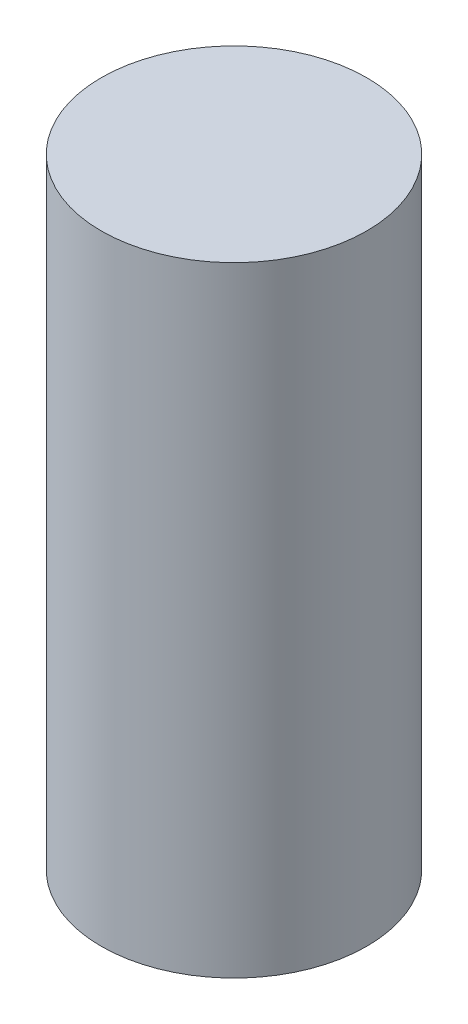
ISO-10303-21;
HEADER;
FILE_DESCRIPTION(('STEP AP214'),'2;1');
FILE_NAME('part.step','',(''),(''),'','','');
FILE_SCHEMA(('AUTOMOTIVE_DESIGN { 1 0 10303 214 1 1 1 1 }'));
ENDSEC;
DATA;
#1=APPLICATION_CONTEXT('core data for automotive mechanical design processes');
#2=APPLICATION_PROTOCOL_DEFINITION('international standard','automotive_design',2000,#1);
#3=PRODUCT_CONTEXT('',#1,'mechanical');
#4=PRODUCT('Part','Part','',(#3));
#5=PRODUCT_RELATED_PRODUCT_CATEGORY('part','',(#4));
#6=PRODUCT_DEFINITION_FORMATION('','',#4);
#7=PRODUCT_DEFINITION_CONTEXT('part definition',#1,'design');
#8=PRODUCT_DEFINITION('design','',#6,#7);
#9=PRODUCT_DEFINITION_SHAPE('','',#8);
#10=(LENGTH_UNIT() NAMED_UNIT(*) SI_UNIT(.MILLI.,.METRE.));
#11=(NAMED_UNIT(*) PLANE_ANGLE_UNIT() SI_UNIT($,.RADIAN.));
#12=(NAMED_UNIT(*) SI_UNIT($,.STERADIAN.) SOLID_ANGLE_UNIT());
#13=UNCERTAINTY_MEASURE_WITH_UNIT(LENGTH_MEASURE(1.E-05),#10,'distance_accuracy_value','');
#14=(GEOMETRIC_REPRESENTATION_CONTEXT(3) GLOBAL_UNCERTAINTY_ASSIGNED_CONTEXT((#13)) GLOBAL_UNIT_ASSIGNED_CONTEXT((#10,
#11,#12)) REPRESENTATION_CONTEXT('',''));
#15=CARTESIAN_POINT('',(0.,0.,0.));
#16=DIRECTION('',(0.,0.,1.));
#17=DIRECTION('',(1.,0.,0.));
#18=AXIS2_PLACEMENT_3D('',#15,#16,#17);
#19=CARTESIAN_POINT('',(0.,7.,0.));
#20=DIRECTION('',(0.,-1.,0.));
#21=DIRECTION('',(0.,0.,-1.));
#22=AXIS2_PLACEMENT_3D('',#19,#20,#21);
#23=CYLINDRICAL_SURFACE('',#22,1.5);
#24=CARTESIAN_POINT('',(0.,7.,0.));
#25=DIRECTION('',(0.,1.,0.));
#26=DIRECTION('',(0.,0.,1.));
#27=AXIS2_PLACEMENT_3D('',#24,#25,#26);
#28=CIRCLE('',#27,1.5);
#29=CARTESIAN_POINT('',(0.,7.,1.5));
#30=VERTEX_POINT('',#29);
#31=EDGE_CURVE('E10',#30,#30,#28,.T.);
#32=ORIENTED_EDGE('',*,*,#31,.F.);
#33=EDGE_LOOP('',(#32));
#34=FACE_BOUND('',#33,.T.);
#35=CARTESIAN_POINT('',(0.,0.,0.));
#36=DIRECTION('',(0.,1.,0.));
#37=DIRECTION('',(0.,0.,1.));
#38=AXIS2_PLACEMENT_3D('',#35,#36,#37);
#39=CIRCLE('',#38,1.5);
#40=CARTESIAN_POINT('',(0.,0.,1.5));
#41=VERTEX_POINT('',#40);
#42=EDGE_CURVE('E46',#41,#41,#39,.T.);
#43=ORIENTED_EDGE('',*,*,#42,.T.);
#44=EDGE_LOOP('',(#43));
#45=FACE_BOUND('',#44,.T.);
#46=ADVANCED_FACE('F43',(#34,#45),#23,.T.);
#47=CARTESIAN_POINT('',(0.,7.,0.));
#48=DIRECTION('',(0.,1.,0.));
#49=DIRECTION('',(0.,0.,1.));
#50=AXIS2_PLACEMENT_3D('',#47,#48,#49);
#51=PLANE('',#50);
#52=ORIENTED_EDGE('',*,*,#31,.T.);
#53=EDGE_LOOP('',(#52));
#54=FACE_BOUND('',#53,.T.);
#55=ADVANCED_FACE('F60',(#54),#51,.T.);
#56=CARTESIAN_POINT('',(0.,0.,0.));
#57=DIRECTION('',(0.,1.,0.));
#58=DIRECTION('',(0.,0.,1.));
#59=AXIS2_PLACEMENT_3D('',#56,#57,#58);
#60=PLANE('',#59);
#61=ORIENTED_EDGE('',*,*,#42,.F.);
#62=EDGE_LOOP('',(#61));
#63=FACE_BOUND('',#62,.T.);
#64=ADVANCED_FACE('F58',(#63),#60,.F.);
#65=CLOSED_SHELL('',(#46,#55,#64));
#66=MANIFOLD_SOLID_BREP('B2',#65);
#67=ADVANCED_BREP_SHAPE_REPRESENTATION('',(#18,#66),#14);
#68=SHAPE_DEFINITION_REPRESENTATION(#9,#67);
ENDSEC;
END-ISO-10303-21;
